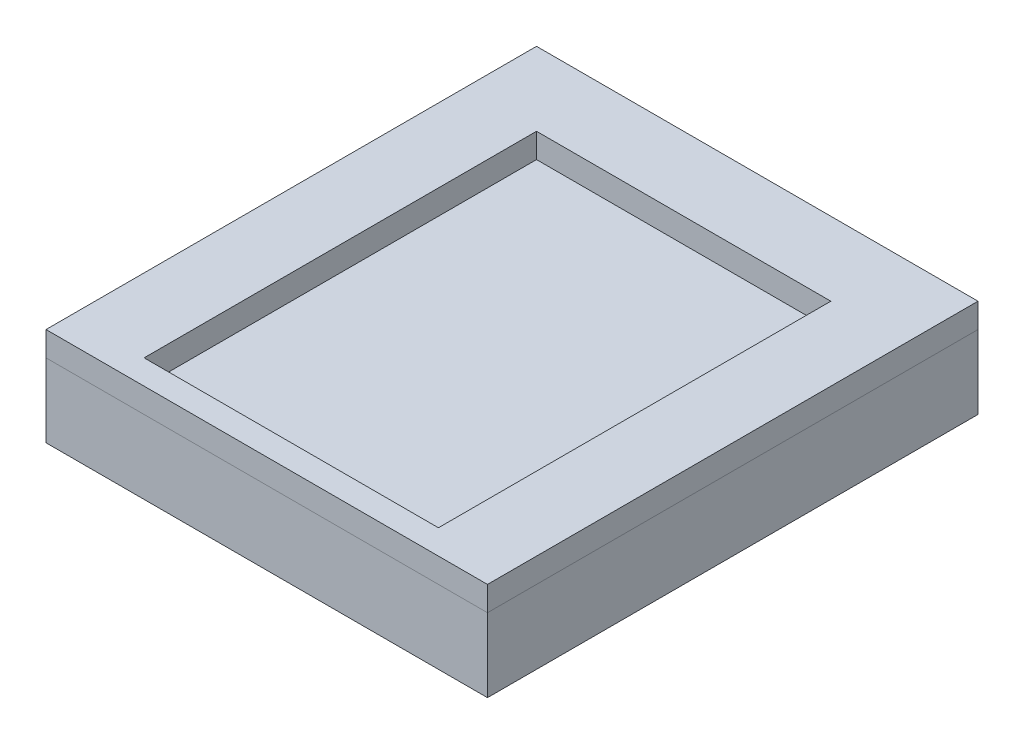
ISO-10303-21;
HEADER;
FILE_DESCRIPTION(('STEP AP214'),'2;1');
FILE_NAME('part.step','',(''),(''),'','','');
FILE_SCHEMA(('AUTOMOTIVE_DESIGN { 1 0 10303 214 1 1 1 1 }'));
ENDSEC;
DATA;
#1=APPLICATION_CONTEXT('core data for automotive mechanical design processes');
#2=APPLICATION_PROTOCOL_DEFINITION('international standard','automotive_design',2000,#1);
#3=PRODUCT_CONTEXT('',#1,'mechanical');
#4=PRODUCT('Part','Part','',(#3));
#5=PRODUCT_RELATED_PRODUCT_CATEGORY('part','',(#4));
#6=PRODUCT_DEFINITION_FORMATION('','',#4);
#7=PRODUCT_DEFINITION_CONTEXT('part definition',#1,'design');
#8=PRODUCT_DEFINITION('design','',#6,#7);
#9=PRODUCT_DEFINITION_SHAPE('','',#8);
#10=(LENGTH_UNIT() NAMED_UNIT(*) SI_UNIT(.MILLI.,.METRE.));
#11=(NAMED_UNIT(*) PLANE_ANGLE_UNIT() SI_UNIT($,.RADIAN.));
#12=(NAMED_UNIT(*) SI_UNIT($,.STERADIAN.) SOLID_ANGLE_UNIT());
#13=UNCERTAINTY_MEASURE_WITH_UNIT(LENGTH_MEASURE(1.E-05),#10,'distance_accuracy_value','');
#14=(GEOMETRIC_REPRESENTATION_CONTEXT(3) GLOBAL_UNCERTAINTY_ASSIGNED_CONTEXT((#13)) GLOBAL_UNIT_ASSIGNED_CONTEXT((#10,
#11,#12)) REPRESENTATION_CONTEXT('',''));
#15=CARTESIAN_POINT('',(0.,0.,0.));
#16=DIRECTION('',(0.,0.,1.));
#17=DIRECTION('',(1.,0.,0.));
#18=AXIS2_PLACEMENT_3D('',#15,#16,#17);
#19=CARTESIAN_POINT('',(0.,4.,0.));
#20=DIRECTION('',(0.,1.,0.));
#21=DIRECTION('',(0.,0.,1.));
#22=AXIS2_PLACEMENT_3D('',#19,#20,#21);
#23=PLANE('',#22);
#24=DIRECTION('',(0.,0.,1.));
#25=VECTOR('',#24,1.);
#26=CARTESIAN_POINT('',(-9.,4.,10.));
#27=LINE('',#26,#25);
#28=CARTESIAN_POINT('',(-9.,4.,-10.));
#29=VERTEX_POINT('',#28);
#30=CARTESIAN_POINT('',(-9.,4.,10.));
#31=VERTEX_POINT('',#30);
#32=EDGE_CURVE('E145',#29,#31,#27,.T.);
#33=ORIENTED_EDGE('',*,*,#32,.T.);
#34=DIRECTION('',(1.,0.,0.));
#35=VECTOR('',#34,1.);
#36=CARTESIAN_POINT('',(9.,4.,10.));
#37=LINE('',#36,#35);
#38=CARTESIAN_POINT('',(9.,4.,10.));
#39=VERTEX_POINT('',#38);
#40=EDGE_CURVE('E148',#31,#39,#37,.T.);
#41=ORIENTED_EDGE('',*,*,#40,.T.);
#42=DIRECTION('',(0.,0.,-1.));
#43=VECTOR('',#42,1.);
#44=CARTESIAN_POINT('',(9.,4.,10.));
#45=LINE('',#44,#43);
#46=CARTESIAN_POINT('',(9.,4.,-10.));
#47=VERTEX_POINT('',#46);
#48=EDGE_CURVE('E151',#39,#47,#45,.T.);
#49=ORIENTED_EDGE('',*,*,#48,.T.);
#50=DIRECTION('',(-1.,0.,0.));
#51=VECTOR('',#50,1.);
#52=CARTESIAN_POINT('',(9.,4.,-10.));
#53=LINE('',#52,#51);
#54=EDGE_CURVE('E153',#47,#29,#53,.T.);
#55=ORIENTED_EDGE('',*,*,#54,.T.);
#56=EDGE_LOOP('',(#33,#41,#49,#55));
#57=FACE_BOUND('',#56,.T.);
#58=DIRECTION('',(1.,0.,0.));
#59=VECTOR('',#58,1.);
#60=CARTESIAN_POINT('',(0.,4.,-7.));
#61=LINE('',#60,#59);
#62=CARTESIAN_POINT('',(-6.,4.,-7.));
#63=VERTEX_POINT('',#62);
#64=CARTESIAN_POINT('',(6.,4.,-7.));
#65=VERTEX_POINT('',#64);
#66=EDGE_CURVE('E117',#63,#65,#61,.T.);
#67=ORIENTED_EDGE('',*,*,#66,.T.);
#68=DIRECTION('',(0.,0.,1.));
#69=VECTOR('',#68,1.);
#70=CARTESIAN_POINT('',(6.,4.,0.));
#71=LINE('',#70,#69);
#72=CARTESIAN_POINT('',(6.,4.,9.));
#73=VERTEX_POINT('',#72);
#74=EDGE_CURVE('E58',#65,#73,#71,.T.);
#75=ORIENTED_EDGE('',*,*,#74,.T.);
#76=DIRECTION('',(-1.,0.,0.));
#77=VECTOR('',#76,1.);
#78=CARTESIAN_POINT('',(0.,4.,9.));
#79=LINE('',#78,#77);
#80=CARTESIAN_POINT('',(-6.,4.,9.));
#81=VERTEX_POINT('',#80);
#82=EDGE_CURVE('E123',#73,#81,#79,.T.);
#83=ORIENTED_EDGE('',*,*,#82,.T.);
#84=DIRECTION('',(0.,0.,-1.));
#85=VECTOR('',#84,1.);
#86=CARTESIAN_POINT('',(-6.,4.,0.));
#87=LINE('',#86,#85);
#88=EDGE_CURVE('E137',#81,#63,#87,.T.);
#89=ORIENTED_EDGE('',*,*,#88,.T.);
#90=EDGE_LOOP('',(#67,#75,#83,#89));
#91=FACE_BOUND('',#90,.T.);
#92=ADVANCED_FACE('F43',(#57,#91),#23,.T.);
#93=CARTESIAN_POINT('',(0.,3.,0.));
#94=DIRECTION('',(0.,1.,0.));
#95=DIRECTION('',(0.,0.,1.));
#96=AXIS2_PLACEMENT_3D('',#93,#94,#95);
#97=PLANE('',#96);
#98=DIRECTION('',(0.,0.,1.));
#99=VECTOR('',#98,1.);
#100=CARTESIAN_POINT('',(-9.,3.,10.));
#101=LINE('',#100,#99);
#102=CARTESIAN_POINT('',(-9.,3.,-10.));
#103=VERTEX_POINT('',#102);
#104=CARTESIAN_POINT('',(-9.,3.,10.));
#105=VERTEX_POINT('',#104);
#106=EDGE_CURVE('E124',#103,#105,#101,.T.);
#107=ORIENTED_EDGE('',*,*,#106,.F.);
#108=DIRECTION('',(-1.,0.,0.));
#109=VECTOR('',#108,1.);
#110=CARTESIAN_POINT('',(9.,3.,-10.));
#111=LINE('',#110,#109);
#112=CARTESIAN_POINT('',(9.,3.,-10.));
#113=VERTEX_POINT('',#112);
#114=EDGE_CURVE('E149',#113,#103,#111,.T.);
#115=ORIENTED_EDGE('',*,*,#114,.F.);
#116=DIRECTION('',(0.,0.,-1.));
#117=VECTOR('',#116,1.);
#118=CARTESIAN_POINT('',(9.,3.,10.));
#119=LINE('',#118,#117);
#120=CARTESIAN_POINT('',(9.,3.,10.));
#121=VERTEX_POINT('',#120);
#122=EDGE_CURVE('E160',#121,#113,#119,.T.);
#123=ORIENTED_EDGE('',*,*,#122,.F.);
#124=DIRECTION('',(1.,0.,0.));
#125=VECTOR('',#124,1.);
#126=CARTESIAN_POINT('',(9.,3.,10.));
#127=LINE('',#126,#125);
#128=EDGE_CURVE('E158',#105,#121,#127,.T.);
#129=ORIENTED_EDGE('',*,*,#128,.F.);
#130=EDGE_LOOP('',(#107,#115,#123,#129));
#131=FACE_BOUND('',#130,.T.);
#132=DIRECTION('',(0.,0.,1.));
#133=VECTOR('',#132,1.);
#134=CARTESIAN_POINT('',(6.,3.,0.));
#135=LINE('',#134,#133);
#136=CARTESIAN_POINT('',(6.,3.,-7.));
#137=VERTEX_POINT('',#136);
#138=CARTESIAN_POINT('',(6.,3.,9.));
#139=VERTEX_POINT('',#138);
#140=EDGE_CURVE('E108',#137,#139,#135,.T.);
#141=ORIENTED_EDGE('',*,*,#140,.F.);
#142=DIRECTION('',(1.,0.,0.));
#143=VECTOR('',#142,1.);
#144=CARTESIAN_POINT('',(0.,3.,-7.));
#145=LINE('',#144,#143);
#146=CARTESIAN_POINT('',(-6.,3.,-7.));
#147=VERTEX_POINT('',#146);
#148=EDGE_CURVE('E131',#147,#137,#145,.T.);
#149=ORIENTED_EDGE('',*,*,#148,.F.);
#150=DIRECTION('',(0.,0.,-1.));
#151=VECTOR('',#150,1.);
#152=CARTESIAN_POINT('',(-6.,3.,0.));
#153=LINE('',#152,#151);
#154=CARTESIAN_POINT('',(-6.,3.,9.));
#155=VERTEX_POINT('',#154);
#156=EDGE_CURVE('E129',#155,#147,#153,.T.);
#157=ORIENTED_EDGE('',*,*,#156,.F.);
#158=DIRECTION('',(-1.,0.,0.));
#159=VECTOR('',#158,1.);
#160=CARTESIAN_POINT('',(0.,3.,9.));
#161=LINE('',#160,#159);
#162=EDGE_CURVE('E116',#139,#155,#161,.T.);
#163=ORIENTED_EDGE('',*,*,#162,.F.);
#164=EDGE_LOOP('',(#141,#149,#157,#163));
#165=FACE_BOUND('',#164,.T.);
#166=ADVANCED_FACE('F128',(#131,#165),#97,.F.);
#167=CARTESIAN_POINT('',(-9.,4.,10.));
#168=DIRECTION('',(1.,0.,0.));
#169=DIRECTION('',(0.,0.,-1.));
#170=AXIS2_PLACEMENT_3D('',#167,#168,#169);
#171=PLANE('',#170);
#172=ORIENTED_EDGE('',*,*,#106,.T.);
#173=DIRECTION('',(0.,-1.,0.));
#174=VECTOR('',#173,1.);
#175=CARTESIAN_POINT('',(-9.,4.,10.));
#176=LINE('',#175,#174);
#177=EDGE_CURVE('E12',#31,#105,#176,.T.);
#178=ORIENTED_EDGE('',*,*,#177,.F.);
#179=ORIENTED_EDGE('',*,*,#32,.F.);
#180=DIRECTION('',(0.,-1.,0.));
#181=VECTOR('',#180,1.);
#182=CARTESIAN_POINT('',(-9.,4.,-10.));
#183=LINE('',#182,#181);
#184=EDGE_CURVE('E155',#29,#103,#183,.T.);
#185=ORIENTED_EDGE('',*,*,#184,.T.);
#186=EDGE_LOOP('',(#172,#178,#179,#185));
#187=FACE_BOUND('',#186,.T.);
#188=ADVANCED_FACE('F45',(#187),#171,.F.);
#189=CARTESIAN_POINT('',(9.,4.,10.));
#190=DIRECTION('',(0.,0.,-1.));
#191=DIRECTION('',(-1.,0.,0.));
#192=AXIS2_PLACEMENT_3D('',#189,#190,#191);
#193=PLANE('',#192);
#194=ORIENTED_EDGE('',*,*,#128,.T.);
#195=DIRECTION('',(0.,-1.,0.));
#196=VECTOR('',#195,1.);
#197=CARTESIAN_POINT('',(9.,4.,10.));
#198=LINE('',#197,#196);
#199=EDGE_CURVE('E51',#39,#121,#198,.T.);
#200=ORIENTED_EDGE('',*,*,#199,.F.);
#201=ORIENTED_EDGE('',*,*,#40,.F.);
#202=ORIENTED_EDGE('',*,*,#177,.T.);
#203=EDGE_LOOP('',(#194,#200,#201,#202));
#204=FACE_BOUND('',#203,.T.);
#205=ADVANCED_FACE('F187',(#204),#193,.F.);
#206=CARTESIAN_POINT('',(9.,4.,10.));
#207=DIRECTION('',(-1.,0.,0.));
#208=DIRECTION('',(0.,0.,1.));
#209=AXIS2_PLACEMENT_3D('',#206,#207,#208);
#210=PLANE('',#209);
#211=ORIENTED_EDGE('',*,*,#122,.T.);
#212=DIRECTION('',(0.,-1.,0.));
#213=VECTOR('',#212,1.);
#214=CARTESIAN_POINT('',(9.,4.,-10.));
#215=LINE('',#214,#213);
#216=EDGE_CURVE('E165',#47,#113,#215,.T.);
#217=ORIENTED_EDGE('',*,*,#216,.F.);
#218=ORIENTED_EDGE('',*,*,#48,.F.);
#219=ORIENTED_EDGE('',*,*,#199,.T.);
#220=EDGE_LOOP('',(#211,#217,#218,#219));
#221=FACE_BOUND('',#220,.T.);
#222=ADVANCED_FACE('F172',(#221),#210,.F.);
#223=CARTESIAN_POINT('',(9.,4.,-10.));
#224=DIRECTION('',(0.,0.,1.));
#225=DIRECTION('',(1.,0.,0.));
#226=AXIS2_PLACEMENT_3D('',#223,#224,#225);
#227=PLANE('',#226);
#228=ORIENTED_EDGE('',*,*,#114,.T.);
#229=ORIENTED_EDGE('',*,*,#184,.F.);
#230=ORIENTED_EDGE('',*,*,#54,.F.);
#231=ORIENTED_EDGE('',*,*,#216,.T.);
#232=EDGE_LOOP('',(#228,#229,#230,#231));
#233=FACE_BOUND('',#232,.T.);
#234=ADVANCED_FACE('F180',(#233),#227,.F.);
#235=CARTESIAN_POINT('',(6.,3.,0.));
#236=DIRECTION('',(-1.,0.,0.));
#237=DIRECTION('',(0.,0.,1.));
#238=AXIS2_PLACEMENT_3D('',#235,#236,#237);
#239=PLANE('',#238);
#240=ORIENTED_EDGE('',*,*,#74,.F.);
#241=DIRECTION('',(0.,1.,0.));
#242=VECTOR('',#241,1.);
#243=CARTESIAN_POINT('',(6.,3.,-7.));
#244=LINE('',#243,#242);
#245=EDGE_CURVE('E112',#137,#65,#244,.T.);
#246=ORIENTED_EDGE('',*,*,#245,.F.);
#247=ORIENTED_EDGE('',*,*,#140,.T.);
#248=DIRECTION('',(0.,1.,0.));
#249=VECTOR('',#248,1.);
#250=CARTESIAN_POINT('',(6.,3.,9.));
#251=LINE('',#250,#249);
#252=EDGE_CURVE('E111',#139,#73,#251,.T.);
#253=ORIENTED_EDGE('',*,*,#252,.T.);
#254=EDGE_LOOP('',(#240,#246,#247,#253));
#255=FACE_BOUND('',#254,.T.);
#256=ADVANCED_FACE('F110',(#255),#239,.T.);
#257=CARTESIAN_POINT('',(0.,3.,9.));
#258=DIRECTION('',(0.,0.,-1.));
#259=DIRECTION('',(-1.,0.,0.));
#260=AXIS2_PLACEMENT_3D('',#257,#258,#259);
#261=PLANE('',#260);
#262=ORIENTED_EDGE('',*,*,#82,.F.);
#263=ORIENTED_EDGE('',*,*,#252,.F.);
#264=ORIENTED_EDGE('',*,*,#162,.T.);
#265=DIRECTION('',(0.,1.,0.));
#266=VECTOR('',#265,1.);
#267=CARTESIAN_POINT('',(-6.,3.,9.));
#268=LINE('',#267,#266);
#269=EDGE_CURVE('E125',#155,#81,#268,.T.);
#270=ORIENTED_EDGE('',*,*,#269,.T.);
#271=EDGE_LOOP('',(#262,#263,#264,#270));
#272=FACE_BOUND('',#271,.T.);
#273=ADVANCED_FACE('F120',(#272),#261,.T.);
#274=CARTESIAN_POINT('',(-6.,3.,0.));
#275=DIRECTION('',(1.,0.,0.));
#276=DIRECTION('',(0.,0.,-1.));
#277=AXIS2_PLACEMENT_3D('',#274,#275,#276);
#278=PLANE('',#277);
#279=ORIENTED_EDGE('',*,*,#88,.F.);
#280=ORIENTED_EDGE('',*,*,#269,.F.);
#281=ORIENTED_EDGE('',*,*,#156,.T.);
#282=DIRECTION('',(0.,1.,0.));
#283=VECTOR('',#282,1.);
#284=CARTESIAN_POINT('',(-6.,3.,-7.));
#285=LINE('',#284,#283);
#286=EDGE_CURVE('E66',#147,#63,#285,.T.);
#287=ORIENTED_EDGE('',*,*,#286,.T.);
#288=EDGE_LOOP('',(#279,#280,#281,#287));
#289=FACE_BOUND('',#288,.T.);
#290=ADVANCED_FACE('F210',(#289),#278,.T.);
#291=CARTESIAN_POINT('',(0.,3.,-7.));
#292=DIRECTION('',(0.,0.,1.));
#293=DIRECTION('',(1.,0.,0.));
#294=AXIS2_PLACEMENT_3D('',#291,#292,#293);
#295=PLANE('',#294);
#296=ORIENTED_EDGE('',*,*,#66,.F.);
#297=ORIENTED_EDGE('',*,*,#286,.F.);
#298=ORIENTED_EDGE('',*,*,#148,.T.);
#299=ORIENTED_EDGE('',*,*,#245,.T.);
#300=EDGE_LOOP('',(#296,#297,#298,#299));
#301=FACE_BOUND('',#300,.T.);
#302=ADVANCED_FACE('F214',(#301),#295,.T.);
#303=CLOSED_SHELL('',(#92,#166,#188,#205,#222,#234,#256,#273,#290,#302));
#304=MANIFOLD_SOLID_BREP('B2',#303);
#305=CARTESIAN_POINT('',(9.,3.,-10.));
#306=DIRECTION('',(0.,0.,1.));
#307=DIRECTION('',(1.,0.,0.));
#308=AXIS2_PLACEMENT_3D('',#305,#306,#307);
#309=PLANE('',#308);
#310=DIRECTION('',(0.,-1.,0.));
#311=VECTOR('',#310,1.);
#312=CARTESIAN_POINT('',(-8.,4.,-10.));
#313=LINE('',#312,#311);
#314=CARTESIAN_POINT('',(-8.,3.,-10.));
#315=VERTEX_POINT('',#314);
#316=CARTESIAN_POINT('',(-8.,1.,-10.));
#317=VERTEX_POINT('',#316);
#318=EDGE_CURVE('E372',#315,#317,#313,.T.);
#319=ORIENTED_EDGE('',*,*,#318,.T.);
#320=DIRECTION('',(-1.,0.,0.));
#321=VECTOR('',#320,1.);
#322=CARTESIAN_POINT('',(-8.,1.,-10.));
#323=LINE('',#322,#321);
#324=CARTESIAN_POINT('',(8.,1.,-10.));
#325=VERTEX_POINT('',#324);
#326=EDGE_CURVE('E367',#325,#317,#323,.T.);
#327=ORIENTED_EDGE('',*,*,#326,.F.);
#328=DIRECTION('',(0.,-1.,0.));
#329=VECTOR('',#328,1.);
#330=CARTESIAN_POINT('',(8.,4.,-10.));
#331=LINE('',#330,#329);
#332=CARTESIAN_POINT('',(8.,3.,-10.));
#333=VERTEX_POINT('',#332);
#334=EDGE_CURVE('E374',#333,#325,#331,.T.);
#335=ORIENTED_EDGE('',*,*,#334,.F.);
#336=DIRECTION('',(-1.,0.,0.));
#337=VECTOR('',#336,1.);
#338=CARTESIAN_POINT('',(9.,3.,-10.));
#339=LINE('',#338,#337);
#340=CARTESIAN_POINT('',(9.,3.,-10.));
#341=VERTEX_POINT('',#340);
#342=EDGE_CURVE('E382',#341,#333,#339,.T.);
#343=ORIENTED_EDGE('',*,*,#342,.F.);
#344=DIRECTION('',(0.,-1.,0.));
#345=VECTOR('',#344,1.);
#346=CARTESIAN_POINT('',(9.,3.,-10.));
#347=LINE('',#346,#345);
#348=CARTESIAN_POINT('',(9.,0.,-10.));
#349=VERTEX_POINT('',#348);
#350=EDGE_CURVE('E394',#341,#349,#347,.T.);
#351=ORIENTED_EDGE('',*,*,#350,.T.);
#352=DIRECTION('',(-1.,0.,0.));
#353=VECTOR('',#352,1.);
#354=CARTESIAN_POINT('',(9.,0.,-10.));
#355=LINE('',#354,#353);
#356=CARTESIAN_POINT('',(-9.,0.,-10.));
#357=VERTEX_POINT('',#356);
#358=EDGE_CURVE('E318',#349,#357,#355,.T.);
#359=ORIENTED_EDGE('',*,*,#358,.T.);
#360=DIRECTION('',(0.,-1.,0.));
#361=VECTOR('',#360,1.);
#362=CARTESIAN_POINT('',(-9.,3.,-10.));
#363=LINE('',#362,#361);
#364=CARTESIAN_POINT('',(-9.,3.,-10.));
#365=VERTEX_POINT('',#364);
#366=EDGE_CURVE('E385',#365,#357,#363,.T.);
#367=ORIENTED_EDGE('',*,*,#366,.F.);
#368=EDGE_CURVE('E296',#315,#365,#339,.T.);
#369=ORIENTED_EDGE('',*,*,#368,.F.);
#370=EDGE_LOOP('',(#319,#327,#335,#343,#351,#359,#367,#369));
#371=FACE_BOUND('',#370,.T.);
#372=ADVANCED_FACE('F273',(#371),#309,.F.);
#373=CARTESIAN_POINT('',(0.,3.,0.));
#374=DIRECTION('',(0.,1.,0.));
#375=DIRECTION('',(0.,0.,1.));
#376=AXIS2_PLACEMENT_3D('',#373,#374,#375);
#377=PLANE('',#376);
#378=DIRECTION('',(-1.,0.,0.));
#379=VECTOR('',#378,1.);
#380=CARTESIAN_POINT('',(0.,3.,9.));
#381=LINE('',#380,#379);
#382=CARTESIAN_POINT('',(8.,3.,9.));
#383=VERTEX_POINT('',#382);
#384=CARTESIAN_POINT('',(-8.,3.,9.));
#385=VERTEX_POINT('',#384);
#386=EDGE_CURVE('E281',#383,#385,#381,.T.);
#387=ORIENTED_EDGE('',*,*,#386,.T.);
#388=DIRECTION('',(0.,0.,-1.));
#389=VECTOR('',#388,1.);
#390=CARTESIAN_POINT('',(-8.,3.,0.));
#391=LINE('',#390,#389);
#392=EDGE_CURVE('E41',#385,#315,#391,.T.);
#393=ORIENTED_EDGE('',*,*,#392,.T.);
#394=ORIENTED_EDGE('',*,*,#368,.T.);
#395=DIRECTION('',(0.,0.,1.));
#396=VECTOR('',#395,1.);
#397=CARTESIAN_POINT('',(-9.,3.,10.));
#398=LINE('',#397,#396);
#399=CARTESIAN_POINT('',(-9.,3.,10.));
#400=VERTEX_POINT('',#399);
#401=EDGE_CURVE('E377',#365,#400,#398,.T.);
#402=ORIENTED_EDGE('',*,*,#401,.T.);
#403=DIRECTION('',(1.,0.,0.));
#404=VECTOR('',#403,1.);
#405=CARTESIAN_POINT('',(9.,3.,10.));
#406=LINE('',#405,#404);
#407=CARTESIAN_POINT('',(9.,3.,10.));
#408=VERTEX_POINT('',#407);
#409=EDGE_CURVE('E326',#400,#408,#406,.T.);
#410=ORIENTED_EDGE('',*,*,#409,.T.);
#411=DIRECTION('',(0.,0.,-1.));
#412=VECTOR('',#411,1.);
#413=CARTESIAN_POINT('',(9.,3.,10.));
#414=LINE('',#413,#412);
#415=EDGE_CURVE('E380',#408,#341,#414,.T.);
#416=ORIENTED_EDGE('',*,*,#415,.T.);
#417=ORIENTED_EDGE('',*,*,#342,.T.);
#418=DIRECTION('',(0.,0.,1.));
#419=VECTOR('',#418,1.);
#420=CARTESIAN_POINT('',(8.,3.,0.));
#421=LINE('',#420,#419);
#422=EDGE_CURVE('E401',#333,#383,#421,.T.);
#423=ORIENTED_EDGE('',*,*,#422,.T.);
#424=EDGE_LOOP('',(#387,#393,#394,#402,#410,#416,#417,#423));
#425=FACE_BOUND('',#424,.T.);
#426=ADVANCED_FACE('F403',(#425),#377,.T.);
#427=CARTESIAN_POINT('',(-9.,3.,10.));
#428=DIRECTION('',(1.,0.,0.));
#429=DIRECTION('',(0.,0.,-1.));
#430=AXIS2_PLACEMENT_3D('',#427,#428,#429);
#431=PLANE('',#430);
#432=DIRECTION('',(0.,0.,1.));
#433=VECTOR('',#432,1.);
#434=CARTESIAN_POINT('',(-9.,0.,10.));
#435=LINE('',#434,#433);
#436=CARTESIAN_POINT('',(-9.,0.,10.));
#437=VERTEX_POINT('',#436);
#438=EDGE_CURVE('E356',#357,#437,#435,.T.);
#439=ORIENTED_EDGE('',*,*,#438,.T.);
#440=DIRECTION('',(0.,-1.,0.));
#441=VECTOR('',#440,1.);
#442=CARTESIAN_POINT('',(-9.,3.,10.));
#443=LINE('',#442,#441);
#444=EDGE_CURVE('E399',#400,#437,#443,.T.);
#445=ORIENTED_EDGE('',*,*,#444,.F.);
#446=ORIENTED_EDGE('',*,*,#401,.F.);
#447=ORIENTED_EDGE('',*,*,#366,.T.);
#448=EDGE_LOOP('',(#439,#445,#446,#447));
#449=FACE_BOUND('',#448,.T.);
#450=ADVANCED_FACE('F275',(#449),#431,.F.);
#451=CARTESIAN_POINT('',(9.,3.,10.));
#452=DIRECTION('',(0.,0.,-1.));
#453=DIRECTION('',(-1.,0.,0.));
#454=AXIS2_PLACEMENT_3D('',#451,#452,#453);
#455=PLANE('',#454);
#456=DIRECTION('',(1.,0.,0.));
#457=VECTOR('',#456,1.);
#458=CARTESIAN_POINT('',(9.,0.,10.));
#459=LINE('',#458,#457);
#460=CARTESIAN_POINT('',(9.,0.,10.));
#461=VERTEX_POINT('',#460);
#462=EDGE_CURVE('E388',#437,#461,#459,.T.);
#463=ORIENTED_EDGE('',*,*,#462,.T.);
#464=DIRECTION('',(0.,-1.,0.));
#465=VECTOR('',#464,1.);
#466=CARTESIAN_POINT('',(9.,3.,10.));
#467=LINE('',#466,#465);
#468=EDGE_CURVE('E396',#408,#461,#467,.T.);
#469=ORIENTED_EDGE('',*,*,#468,.F.);
#470=ORIENTED_EDGE('',*,*,#409,.F.);
#471=ORIENTED_EDGE('',*,*,#444,.T.);
#472=EDGE_LOOP('',(#463,#469,#470,#471));
#473=FACE_BOUND('',#472,.T.);
#474=ADVANCED_FACE('F413',(#473),#455,.F.);
#475=CARTESIAN_POINT('',(9.,3.,10.));
#476=DIRECTION('',(-1.,0.,0.));
#477=DIRECTION('',(0.,0.,1.));
#478=AXIS2_PLACEMENT_3D('',#475,#476,#477);
#479=PLANE('',#478);
#480=DIRECTION('',(0.,0.,-1.));
#481=VECTOR('',#480,1.);
#482=CARTESIAN_POINT('',(9.,0.,10.));
#483=LINE('',#482,#481);
#484=EDGE_CURVE('E390',#461,#349,#483,.T.);
#485=ORIENTED_EDGE('',*,*,#484,.T.);
#486=ORIENTED_EDGE('',*,*,#350,.F.);
#487=ORIENTED_EDGE('',*,*,#415,.F.);
#488=ORIENTED_EDGE('',*,*,#468,.T.);
#489=EDGE_LOOP('',(#485,#486,#487,#488));
#490=FACE_BOUND('',#489,.T.);
#491=ADVANCED_FACE('F416',(#490),#479,.F.);
#492=CARTESIAN_POINT('',(0.,0.,0.));
#493=DIRECTION('',(0.,1.,0.));
#494=DIRECTION('',(0.,0.,1.));
#495=AXIS2_PLACEMENT_3D('',#492,#493,#494);
#496=PLANE('',#495);
#497=ORIENTED_EDGE('',*,*,#438,.F.);
#498=ORIENTED_EDGE('',*,*,#358,.F.);
#499=ORIENTED_EDGE('',*,*,#484,.F.);
#500=ORIENTED_EDGE('',*,*,#462,.F.);
#501=EDGE_LOOP('',(#497,#498,#499,#500));
#502=FACE_BOUND('',#501,.T.);
#503=ADVANCED_FACE('F418',(#502),#496,.F.);
#504=CARTESIAN_POINT('',(-8.,4.,-10.));
#505=DIRECTION('',(1.,0.,0.));
#506=DIRECTION('',(0.,0.,-1.));
#507=AXIS2_PLACEMENT_3D('',#504,#505,#506);
#508=PLANE('',#507);
#509=DIRECTION('',(0.,-1.,0.));
#510=VECTOR('',#509,1.);
#511=CARTESIAN_POINT('',(-8.,4.,9.));
#512=LINE('',#511,#510);
#513=CARTESIAN_POINT('',(-8.,1.,9.));
#514=VERTEX_POINT('',#513);
#515=EDGE_CURVE('E348',#385,#514,#512,.T.);
#516=ORIENTED_EDGE('',*,*,#515,.T.);
#517=DIRECTION('',(0.,0.,1.));
#518=VECTOR('',#517,1.);
#519=CARTESIAN_POINT('',(-8.,1.,-10.));
#520=LINE('',#519,#518);
#521=EDGE_CURVE('E352',#317,#514,#520,.T.);
#522=ORIENTED_EDGE('',*,*,#521,.F.);
#523=ORIENTED_EDGE('',*,*,#318,.F.);
#524=ORIENTED_EDGE('',*,*,#392,.F.);
#525=EDGE_LOOP('',(#516,#522,#523,#524));
#526=FACE_BOUND('',#525,.T.);
#527=ADVANCED_FACE('F350',(#526),#508,.T.);
#528=CARTESIAN_POINT('',(-8.,4.,9.));
#529=DIRECTION('',(0.,0.,-1.));
#530=DIRECTION('',(-1.,0.,0.));
#531=AXIS2_PLACEMENT_3D('',#528,#529,#530);
#532=PLANE('',#531);
#533=DIRECTION('',(0.,-1.,0.));
#534=VECTOR('',#533,1.);
#535=CARTESIAN_POINT('',(8.,4.,9.));
#536=LINE('',#535,#534);
#537=CARTESIAN_POINT('',(8.,1.,9.));
#538=VERTEX_POINT('',#537);
#539=EDGE_CURVE('E288',#383,#538,#536,.T.);
#540=ORIENTED_EDGE('',*,*,#539,.T.);
#541=DIRECTION('',(1.,0.,0.));
#542=VECTOR('',#541,1.);
#543=CARTESIAN_POINT('',(-8.,1.,9.));
#544=LINE('',#543,#542);
#545=EDGE_CURVE('E359',#514,#538,#544,.T.);
#546=ORIENTED_EDGE('',*,*,#545,.F.);
#547=ORIENTED_EDGE('',*,*,#515,.F.);
#548=ORIENTED_EDGE('',*,*,#386,.F.);
#549=EDGE_LOOP('',(#540,#546,#547,#548));
#550=FACE_BOUND('',#549,.T.);
#551=ADVANCED_FACE('F360',(#550),#532,.T.);
#552=CARTESIAN_POINT('',(8.,4.,-10.));
#553=DIRECTION('',(-1.,0.,0.));
#554=DIRECTION('',(0.,0.,1.));
#555=AXIS2_PLACEMENT_3D('',#552,#553,#554);
#556=PLANE('',#555);
#557=ORIENTED_EDGE('',*,*,#334,.T.);
#558=DIRECTION('',(0.,0.,-1.));
#559=VECTOR('',#558,1.);
#560=CARTESIAN_POINT('',(8.,1.,-10.));
#561=LINE('',#560,#559);
#562=EDGE_CURVE('E363',#538,#325,#561,.T.);
#563=ORIENTED_EDGE('',*,*,#562,.F.);
#564=ORIENTED_EDGE('',*,*,#539,.F.);
#565=ORIENTED_EDGE('',*,*,#422,.F.);
#566=EDGE_LOOP('',(#557,#563,#564,#565));
#567=FACE_BOUND('',#566,.T.);
#568=ADVANCED_FACE('F406',(#567),#556,.T.);
#569=CARTESIAN_POINT('',(0.,1.,0.));
#570=DIRECTION('',(0.,1.,0.));
#571=DIRECTION('',(0.,0.,1.));
#572=AXIS2_PLACEMENT_3D('',#569,#570,#571);
#573=PLANE('',#572);
#574=ORIENTED_EDGE('',*,*,#521,.T.);
#575=ORIENTED_EDGE('',*,*,#545,.T.);
#576=ORIENTED_EDGE('',*,*,#562,.T.);
#577=ORIENTED_EDGE('',*,*,#326,.T.);
#578=EDGE_LOOP('',(#574,#575,#576,#577));
#579=FACE_BOUND('',#578,.T.);
#580=ADVANCED_FACE('F365',(#579),#573,.T.);
#581=CLOSED_SHELL('',(#372,#426,#450,#474,#491,#503,#527,#551,#568,#580));
#582=MANIFOLD_SOLID_BREP('B6',#581);
#583=ADVANCED_BREP_SHAPE_REPRESENTATION('',(#18,#304,#582),#14);
#584=SHAPE_DEFINITION_REPRESENTATION(#9,#583);
ENDSEC;
END-ISO-10303-21;
